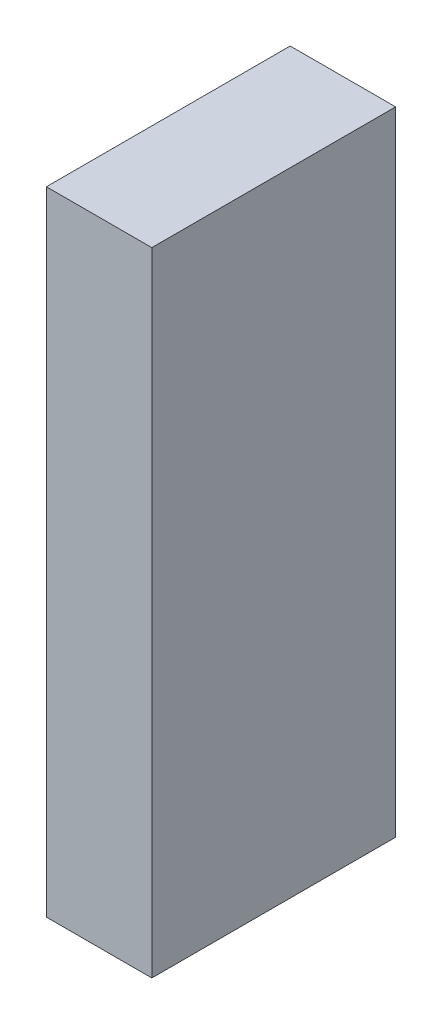
ISO-10303-21;
HEADER;
FILE_DESCRIPTION(('STEP AP214'),'2;1');
FILE_NAME('part.step','',(''),(''),'','','');
FILE_SCHEMA(('AUTOMOTIVE_DESIGN { 1 0 10303 214 1 1 1 1 }'));
ENDSEC;
DATA;
#1=APPLICATION_CONTEXT('core data for automotive mechanical design processes');
#2=APPLICATION_PROTOCOL_DEFINITION('international standard','automotive_design',2000,#1);
#3=PRODUCT_CONTEXT('',#1,'mechanical');
#4=PRODUCT('Part','Part','',(#3));
#5=PRODUCT_RELATED_PRODUCT_CATEGORY('part','',(#4));
#6=PRODUCT_DEFINITION_FORMATION('','',#4);
#7=PRODUCT_DEFINITION_CONTEXT('part definition',#1,'design');
#8=PRODUCT_DEFINITION('design','',#6,#7);
#9=PRODUCT_DEFINITION_SHAPE('','',#8);
#10=(LENGTH_UNIT() NAMED_UNIT(*) SI_UNIT(.MILLI.,.METRE.));
#11=(NAMED_UNIT(*) PLANE_ANGLE_UNIT() SI_UNIT($,.RADIAN.));
#12=(NAMED_UNIT(*) SI_UNIT($,.STERADIAN.) SOLID_ANGLE_UNIT());
#13=UNCERTAINTY_MEASURE_WITH_UNIT(LENGTH_MEASURE(1.E-05),#10,'distance_accuracy_value','');
#14=(GEOMETRIC_REPRESENTATION_CONTEXT(3) GLOBAL_UNCERTAINTY_ASSIGNED_CONTEXT((#13)) GLOBAL_UNIT_ASSIGNED_CONTEXT((#10,
#11,#12)) REPRESENTATION_CONTEXT('',''));
#15=CARTESIAN_POINT('',(0.,0.,0.));
#16=DIRECTION('',(0.,0.,1.));
#17=DIRECTION('',(1.,0.,0.));
#18=AXIS2_PLACEMENT_3D('',#15,#16,#17);
#19=CARTESIAN_POINT('',(-19.05,228.6,44.053125));
#20=DIRECTION('',(1.,0.,0.));
#21=DIRECTION('',(0.,0.,-1.));
#22=AXIS2_PLACEMENT_3D('',#19,#20,#21);
#23=PLANE('',#22);
#24=DIRECTION('',(0.,0.,1.));
#25=VECTOR('',#24,1.);
#26=CARTESIAN_POINT('',(-19.05,0.,44.053125));
#27=LINE('',#26,#25);
#28=CARTESIAN_POINT('',(-19.05,0.,-44.053125));
#29=VERTEX_POINT('',#28);
#30=CARTESIAN_POINT('',(-19.05,0.,44.053125));
#31=VERTEX_POINT('',#30);
#32=EDGE_CURVE('E96',#29,#31,#27,.T.);
#33=ORIENTED_EDGE('',*,*,#32,.T.);
#34=DIRECTION('',(0.,-1.,0.));
#35=VECTOR('',#34,1.);
#36=CARTESIAN_POINT('',(-19.05,228.6,44.053125));
#37=LINE('',#36,#35);
#38=CARTESIAN_POINT('',(-19.05,228.6,44.053125));
#39=VERTEX_POINT('',#38);
#40=EDGE_CURVE('E11',#39,#31,#37,.T.);
#41=ORIENTED_EDGE('',*,*,#40,.F.);
#42=DIRECTION('',(0.,0.,1.));
#43=VECTOR('',#42,1.);
#44=CARTESIAN_POINT('',(-19.05,228.6,44.053125));
#45=LINE('',#44,#43);
#46=CARTESIAN_POINT('',(-19.05,228.6,-44.053125));
#47=VERTEX_POINT('',#46);
#48=EDGE_CURVE('E84',#47,#39,#45,.T.);
#49=ORIENTED_EDGE('',*,*,#48,.F.);
#50=DIRECTION('',(0.,-1.,0.));
#51=VECTOR('',#50,1.);
#52=CARTESIAN_POINT('',(-19.05,228.6,-44.053125));
#53=LINE('',#52,#51);
#54=EDGE_CURVE('E92',#47,#29,#53,.T.);
#55=ORIENTED_EDGE('',*,*,#54,.T.);
#56=EDGE_LOOP('',(#33,#41,#49,#55));
#57=FACE_BOUND('',#56,.T.);
#58=ADVANCED_FACE('F33',(#57),#23,.F.);
#59=CARTESIAN_POINT('',(19.05,228.6,44.053125));
#60=DIRECTION('',(0.,0.,-1.));
#61=DIRECTION('',(-1.,0.,0.));
#62=AXIS2_PLACEMENT_3D('',#59,#60,#61);
#63=PLANE('',#62);
#64=DIRECTION('',(1.,0.,0.));
#65=VECTOR('',#64,1.);
#66=CARTESIAN_POINT('',(19.05,0.,44.053125));
#67=LINE('',#66,#65);
#68=CARTESIAN_POINT('',(19.05,0.,44.053125));
#69=VERTEX_POINT('',#68);
#70=EDGE_CURVE('E88',#31,#69,#67,.T.);
#71=ORIENTED_EDGE('',*,*,#70,.T.);
#72=DIRECTION('',(0.,-1.,0.));
#73=VECTOR('',#72,1.);
#74=CARTESIAN_POINT('',(19.05,228.6,44.053125));
#75=LINE('',#74,#73);
#76=CARTESIAN_POINT('',(19.05,228.6,44.053125));
#77=VERTEX_POINT('',#76);
#78=EDGE_CURVE('E41',#77,#69,#75,.T.);
#79=ORIENTED_EDGE('',*,*,#78,.F.);
#80=DIRECTION('',(1.,0.,0.));
#81=VECTOR('',#80,1.);
#82=CARTESIAN_POINT('',(19.05,228.6,44.053125));
#83=LINE('',#82,#81);
#84=EDGE_CURVE('E79',#39,#77,#83,.T.);
#85=ORIENTED_EDGE('',*,*,#84,.F.);
#86=ORIENTED_EDGE('',*,*,#40,.T.);
#87=EDGE_LOOP('',(#71,#79,#85,#86));
#88=FACE_BOUND('',#87,.T.);
#89=ADVANCED_FACE('F87',(#88),#63,.F.);
#90=CARTESIAN_POINT('',(19.05,228.6,44.053125));
#91=DIRECTION('',(-1.,0.,0.));
#92=DIRECTION('',(0.,0.,1.));
#93=AXIS2_PLACEMENT_3D('',#90,#91,#92);
#94=PLANE('',#93);
#95=DIRECTION('',(0.,0.,-1.));
#96=VECTOR('',#95,1.);
#97=CARTESIAN_POINT('',(19.05,0.,44.053125));
#98=LINE('',#97,#96);
#99=CARTESIAN_POINT('',(19.05,0.,-44.053125));
#100=VERTEX_POINT('',#99);
#101=EDGE_CURVE('E66',#69,#100,#98,.T.);
#102=ORIENTED_EDGE('',*,*,#101,.T.);
#103=DIRECTION('',(0.,-1.,0.));
#104=VECTOR('',#103,1.);
#105=CARTESIAN_POINT('',(19.05,228.6,-44.053125));
#106=LINE('',#105,#104);
#107=CARTESIAN_POINT('',(19.05,228.6,-44.053125));
#108=VERTEX_POINT('',#107);
#109=EDGE_CURVE('E89',#108,#100,#106,.T.);
#110=ORIENTED_EDGE('',*,*,#109,.F.);
#111=DIRECTION('',(0.,0.,-1.));
#112=VECTOR('',#111,1.);
#113=CARTESIAN_POINT('',(19.05,228.6,44.053125));
#114=LINE('',#113,#112);
#115=EDGE_CURVE('E82',#77,#108,#114,.T.);
#116=ORIENTED_EDGE('',*,*,#115,.F.);
#117=ORIENTED_EDGE('',*,*,#78,.T.);
#118=EDGE_LOOP('',(#102,#110,#116,#117));
#119=FACE_BOUND('',#118,.T.);
#120=ADVANCED_FACE('F90',(#119),#94,.F.);
#121=CARTESIAN_POINT('',(19.05,228.6,-44.053125));
#122=DIRECTION('',(0.,0.,1.));
#123=DIRECTION('',(1.,0.,0.));
#124=AXIS2_PLACEMENT_3D('',#121,#122,#123);
#125=PLANE('',#124);
#126=DIRECTION('',(-1.,0.,0.));
#127=VECTOR('',#126,1.);
#128=CARTESIAN_POINT('',(19.05,0.,-44.053125));
#129=LINE('',#128,#127);
#130=EDGE_CURVE('E72',#100,#29,#129,.T.);
#131=ORIENTED_EDGE('',*,*,#130,.T.);
#132=ORIENTED_EDGE('',*,*,#54,.F.);
#133=DIRECTION('',(-1.,0.,0.));
#134=VECTOR('',#133,1.);
#135=CARTESIAN_POINT('',(19.05,228.6,-44.053125));
#136=LINE('',#135,#134);
#137=EDGE_CURVE('E49',#108,#47,#136,.T.);
#138=ORIENTED_EDGE('',*,*,#137,.F.);
#139=ORIENTED_EDGE('',*,*,#109,.T.);
#140=EDGE_LOOP('',(#131,#132,#138,#139));
#141=FACE_BOUND('',#140,.T.);
#142=ADVANCED_FACE('F103',(#141),#125,.F.);
#143=CARTESIAN_POINT('',(0.,228.6,0.));
#144=DIRECTION('',(0.,1.,0.));
#145=DIRECTION('',(0.,0.,1.));
#146=AXIS2_PLACEMENT_3D('',#143,#144,#145);
#147=PLANE('',#146);
#148=ORIENTED_EDGE('',*,*,#48,.T.);
#149=ORIENTED_EDGE('',*,*,#84,.T.);
#150=ORIENTED_EDGE('',*,*,#115,.T.);
#151=ORIENTED_EDGE('',*,*,#137,.T.);
#152=EDGE_LOOP('',(#148,#149,#150,#151));
#153=FACE_BOUND('',#152,.T.);
#154=ADVANCED_FACE('F80',(#153),#147,.T.);
#155=CARTESIAN_POINT('',(0.,0.,0.));
#156=DIRECTION('',(0.,1.,0.));
#157=DIRECTION('',(0.,0.,1.));
#158=AXIS2_PLACEMENT_3D('',#155,#156,#157);
#159=PLANE('',#158);
#160=ORIENTED_EDGE('',*,*,#32,.F.);
#161=ORIENTED_EDGE('',*,*,#130,.F.);
#162=ORIENTED_EDGE('',*,*,#101,.F.);
#163=ORIENTED_EDGE('',*,*,#70,.F.);
#164=EDGE_LOOP('',(#160,#161,#162,#163));
#165=FACE_BOUND('',#164,.T.);
#166=ADVANCED_FACE('F106',(#165),#159,.F.);
#167=CLOSED_SHELL('',(#58,#89,#120,#142,#154,#166));
#168=MANIFOLD_SOLID_BREP('B2',#167);
#169=ADVANCED_BREP_SHAPE_REPRESENTATION('',(#18,#168),#14);
#170=SHAPE_DEFINITION_REPRESENTATION(#9,#169);
ENDSEC;
END-ISO-10303-21;
